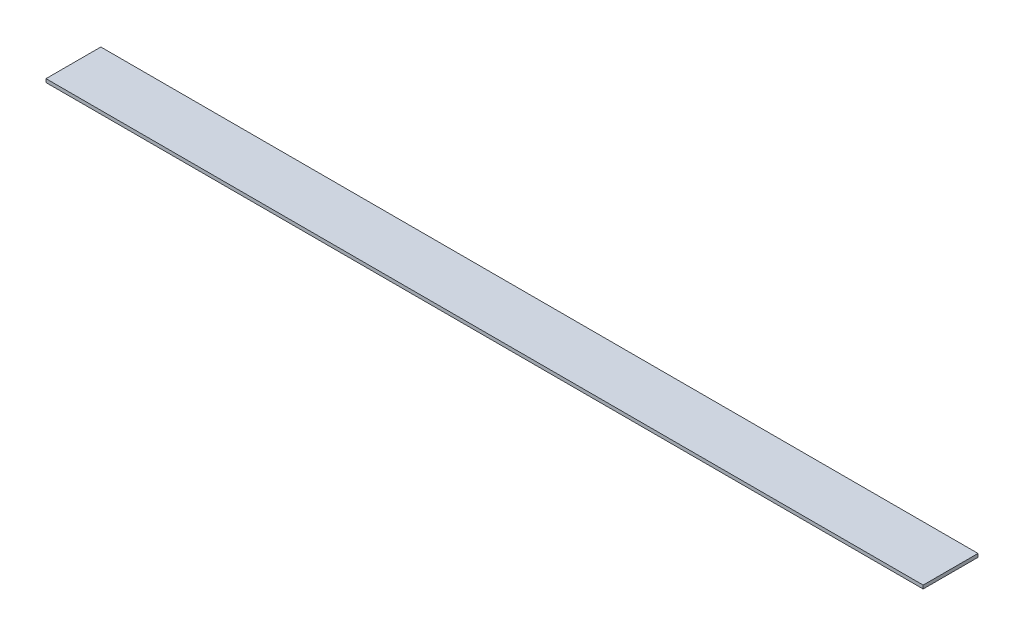
ISO-10303-21;
HEADER;
FILE_DESCRIPTION(('STEP AP214'),'2;1');
FILE_NAME('part.step','',(''),(''),'','','');
FILE_SCHEMA(('AUTOMOTIVE_DESIGN { 1 0 10303 214 1 1 1 1 }'));
ENDSEC;
DATA;
#1=APPLICATION_CONTEXT('core data for automotive mechanical design processes');
#2=APPLICATION_PROTOCOL_DEFINITION('international standard','automotive_design',2000,#1);
#3=PRODUCT_CONTEXT('',#1,'mechanical');
#4=PRODUCT('Part','Part','',(#3));
#5=PRODUCT_RELATED_PRODUCT_CATEGORY('part','',(#4));
#6=PRODUCT_DEFINITION_FORMATION('','',#4);
#7=PRODUCT_DEFINITION_CONTEXT('part definition',#1,'design');
#8=PRODUCT_DEFINITION('design','',#6,#7);
#9=PRODUCT_DEFINITION_SHAPE('','',#8);
#10=(LENGTH_UNIT() NAMED_UNIT(*) SI_UNIT(.MILLI.,.METRE.));
#11=(NAMED_UNIT(*) PLANE_ANGLE_UNIT() SI_UNIT($,.RADIAN.));
#12=(NAMED_UNIT(*) SI_UNIT($,.STERADIAN.) SOLID_ANGLE_UNIT());
#13=UNCERTAINTY_MEASURE_WITH_UNIT(LENGTH_MEASURE(1.E-05),#10,'distance_accuracy_value','');
#14=(GEOMETRIC_REPRESENTATION_CONTEXT(3) GLOBAL_UNCERTAINTY_ASSIGNED_CONTEXT((#13)) GLOBAL_UNIT_ASSIGNED_CONTEXT((#10,
#11,#12)) REPRESENTATION_CONTEXT('',''));
#15=CARTESIAN_POINT('',(0.,0.,0.));
#16=DIRECTION('',(0.,0.,1.));
#17=DIRECTION('',(1.,0.,0.));
#18=AXIS2_PLACEMENT_3D('',#15,#16,#17);
#19=CARTESIAN_POINT('',(0.,1.5875,0.));
#20=DIRECTION('',(1.,0.,0.));
#21=DIRECTION('',(0.,0.,-1.));
#22=AXIS2_PLACEMENT_3D('',#19,#20,#21);
#23=PLANE('',#22);
#24=DIRECTION('',(0.,0.,1.));
#25=VECTOR('',#24,1.);
#26=CARTESIAN_POINT('',(0.,0.,0.));
#27=LINE('',#26,#25);
#28=CARTESIAN_POINT('',(0.,0.,-25.4));
#29=VERTEX_POINT('',#28);
#30=CARTESIAN_POINT('',(0.,0.,0.));
#31=VERTEX_POINT('',#30);
#32=EDGE_CURVE('E97',#29,#31,#27,.T.);
#33=ORIENTED_EDGE('',*,*,#32,.T.);
#34=DIRECTION('',(0.,-1.,0.));
#35=VECTOR('',#34,1.);
#36=CARTESIAN_POINT('',(0.,1.5875,0.));
#37=LINE('',#36,#35);
#38=CARTESIAN_POINT('',(0.,1.5875,0.));
#39=VERTEX_POINT('',#38);
#40=EDGE_CURVE('E11',#39,#31,#37,.T.);
#41=ORIENTED_EDGE('',*,*,#40,.F.);
#42=DIRECTION('',(0.,0.,1.));
#43=VECTOR('',#42,1.);
#44=CARTESIAN_POINT('',(0.,1.5875,0.));
#45=LINE('',#44,#43);
#46=CARTESIAN_POINT('',(0.,1.5875,-25.4));
#47=VERTEX_POINT('',#46);
#48=EDGE_CURVE('E85',#47,#39,#45,.T.);
#49=ORIENTED_EDGE('',*,*,#48,.F.);
#50=DIRECTION('',(0.,-1.,0.));
#51=VECTOR('',#50,1.);
#52=CARTESIAN_POINT('',(0.,1.5875,-25.4));
#53=LINE('',#52,#51);
#54=EDGE_CURVE('E93',#47,#29,#53,.T.);
#55=ORIENTED_EDGE('',*,*,#54,.T.);
#56=EDGE_LOOP('',(#33,#41,#49,#55));
#57=FACE_BOUND('',#56,.T.);
#58=ADVANCED_FACE('F34',(#57),#23,.F.);
#59=CARTESIAN_POINT('',(0.,1.5875,0.));
#60=DIRECTION('',(0.,0.,-1.));
#61=DIRECTION('',(-1.,0.,0.));
#62=AXIS2_PLACEMENT_3D('',#59,#60,#61);
#63=PLANE('',#62);
#64=DIRECTION('',(1.,0.,0.));
#65=VECTOR('',#64,1.);
#66=CARTESIAN_POINT('',(0.,0.,0.));
#67=LINE('',#66,#65);
#68=CARTESIAN_POINT('',(406.4,0.,0.));
#69=VERTEX_POINT('',#68);
#70=EDGE_CURVE('E89',#31,#69,#67,.T.);
#71=ORIENTED_EDGE('',*,*,#70,.T.);
#72=DIRECTION('',(0.,-1.,0.));
#73=VECTOR('',#72,1.);
#74=CARTESIAN_POINT('',(406.4,1.5875,0.));
#75=LINE('',#74,#73);
#76=CARTESIAN_POINT('',(406.4,1.5875,0.));
#77=VERTEX_POINT('',#76);
#78=EDGE_CURVE('E42',#77,#69,#75,.T.);
#79=ORIENTED_EDGE('',*,*,#78,.F.);
#80=DIRECTION('',(1.,0.,0.));
#81=VECTOR('',#80,1.);
#82=CARTESIAN_POINT('',(0.,1.5875,0.));
#83=LINE('',#82,#81);
#84=EDGE_CURVE('E80',#39,#77,#83,.T.);
#85=ORIENTED_EDGE('',*,*,#84,.F.);
#86=ORIENTED_EDGE('',*,*,#40,.T.);
#87=EDGE_LOOP('',(#71,#79,#85,#86));
#88=FACE_BOUND('',#87,.T.);
#89=ADVANCED_FACE('F88',(#88),#63,.F.);
#90=CARTESIAN_POINT('',(406.4,1.5875,0.));
#91=DIRECTION('',(-1.,0.,0.));
#92=DIRECTION('',(0.,0.,1.));
#93=AXIS2_PLACEMENT_3D('',#90,#91,#92);
#94=PLANE('',#93);
#95=DIRECTION('',(0.,0.,-1.));
#96=VECTOR('',#95,1.);
#97=CARTESIAN_POINT('',(406.4,0.,0.));
#98=LINE('',#97,#96);
#99=CARTESIAN_POINT('',(406.4,0.,-25.4));
#100=VERTEX_POINT('',#99);
#101=EDGE_CURVE('E67',#69,#100,#98,.T.);
#102=ORIENTED_EDGE('',*,*,#101,.T.);
#103=DIRECTION('',(0.,-1.,0.));
#104=VECTOR('',#103,1.);
#105=CARTESIAN_POINT('',(406.4,1.5875,-25.4));
#106=LINE('',#105,#104);
#107=CARTESIAN_POINT('',(406.4,1.5875,-25.4));
#108=VERTEX_POINT('',#107);
#109=EDGE_CURVE('E90',#108,#100,#106,.T.);
#110=ORIENTED_EDGE('',*,*,#109,.F.);
#111=DIRECTION('',(0.,0.,-1.));
#112=VECTOR('',#111,1.);
#113=CARTESIAN_POINT('',(406.4,1.5875,0.));
#114=LINE('',#113,#112);
#115=EDGE_CURVE('E83',#77,#108,#114,.T.);
#116=ORIENTED_EDGE('',*,*,#115,.F.);
#117=ORIENTED_EDGE('',*,*,#78,.T.);
#118=EDGE_LOOP('',(#102,#110,#116,#117));
#119=FACE_BOUND('',#118,.T.);
#120=ADVANCED_FACE('F91',(#119),#94,.F.);
#121=CARTESIAN_POINT('',(0.,1.5875,-25.4));
#122=DIRECTION('',(0.,0.,1.));
#123=DIRECTION('',(1.,0.,0.));
#124=AXIS2_PLACEMENT_3D('',#121,#122,#123);
#125=PLANE('',#124);
#126=DIRECTION('',(-1.,0.,0.));
#127=VECTOR('',#126,1.);
#128=CARTESIAN_POINT('',(0.,0.,-25.4));
#129=LINE('',#128,#127);
#130=EDGE_CURVE('E73',#100,#29,#129,.T.);
#131=ORIENTED_EDGE('',*,*,#130,.T.);
#132=ORIENTED_EDGE('',*,*,#54,.F.);
#133=DIRECTION('',(-1.,0.,0.));
#134=VECTOR('',#133,1.);
#135=CARTESIAN_POINT('',(0.,1.5875,-25.4));
#136=LINE('',#135,#134);
#137=EDGE_CURVE('E50',#108,#47,#136,.T.);
#138=ORIENTED_EDGE('',*,*,#137,.F.);
#139=ORIENTED_EDGE('',*,*,#109,.T.);
#140=EDGE_LOOP('',(#131,#132,#138,#139));
#141=FACE_BOUND('',#140,.T.);
#142=ADVANCED_FACE('F104',(#141),#125,.F.);
#143=CARTESIAN_POINT('',(0.,1.5875,0.));
#144=DIRECTION('',(0.,-1.,0.));
#145=DIRECTION('',(0.,0.,-1.));
#146=AXIS2_PLACEMENT_3D('',#143,#144,#145);
#147=PLANE('',#146);
#148=ORIENTED_EDGE('',*,*,#48,.T.);
#149=ORIENTED_EDGE('',*,*,#84,.T.);
#150=ORIENTED_EDGE('',*,*,#115,.T.);
#151=ORIENTED_EDGE('',*,*,#137,.T.);
#152=EDGE_LOOP('',(#148,#149,#150,#151));
#153=FACE_BOUND('',#152,.T.);
#154=ADVANCED_FACE('F81',(#153),#147,.F.);
#155=CARTESIAN_POINT('',(0.,0.,0.));
#156=DIRECTION('',(0.,-1.,0.));
#157=DIRECTION('',(0.,0.,-1.));
#158=AXIS2_PLACEMENT_3D('',#155,#156,#157);
#159=PLANE('',#158);
#160=ORIENTED_EDGE('',*,*,#32,.F.);
#161=ORIENTED_EDGE('',*,*,#130,.F.);
#162=ORIENTED_EDGE('',*,*,#101,.F.);
#163=ORIENTED_EDGE('',*,*,#70,.F.);
#164=EDGE_LOOP('',(#160,#161,#162,#163));
#165=FACE_BOUND('',#164,.T.);
#166=ADVANCED_FACE('F107',(#165),#159,.T.);
#167=CLOSED_SHELL('',(#58,#89,#120,#142,#154,#166));
#168=MANIFOLD_SOLID_BREP('B2',#167);
#169=ADVANCED_BREP_SHAPE_REPRESENTATION('',(#18,#168),#14);
#170=SHAPE_DEFINITION_REPRESENTATION(#9,#169);
ENDSEC;
END-ISO-10303-21;
